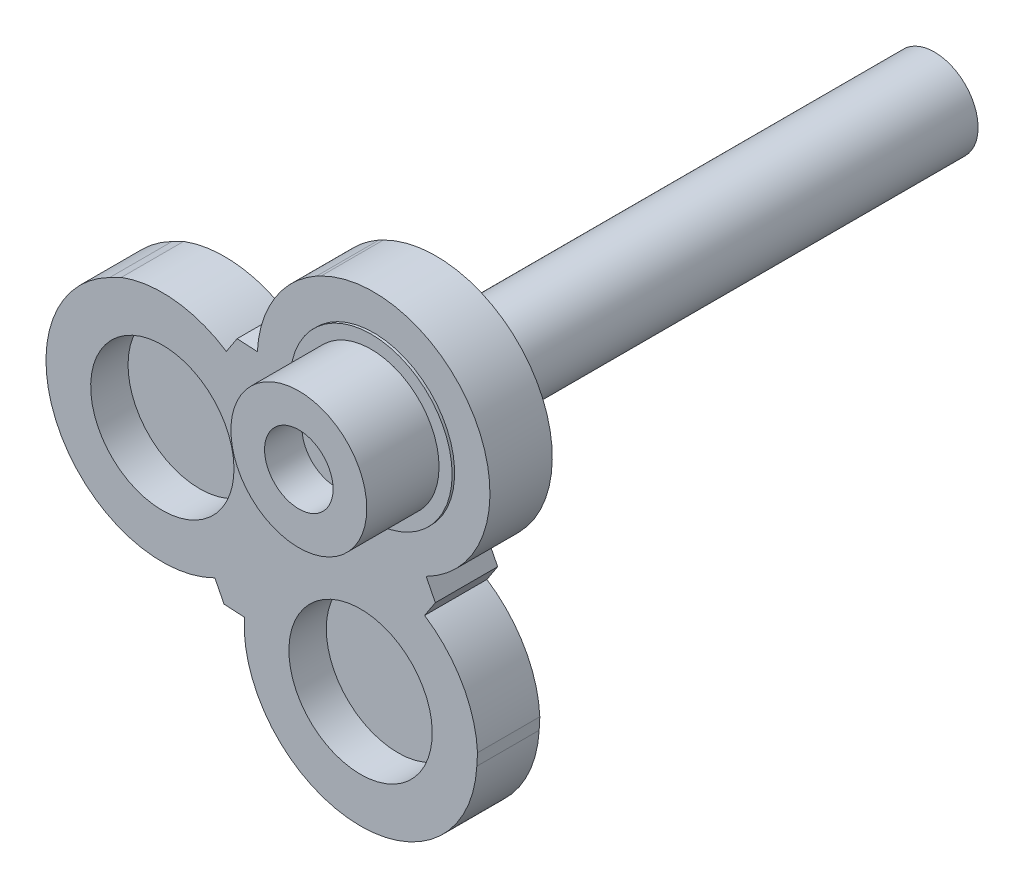
ISO-10303-21;
HEADER;
FILE_DESCRIPTION(('STEP AP214'),'2;1');
FILE_NAME('part.step','',(''),(''),'','','');
FILE_SCHEMA(('AUTOMOTIVE_DESIGN { 1 0 10303 214 1 1 1 1 }'));
ENDSEC;
DATA;
#1=APPLICATION_CONTEXT('core data for automotive mechanical design processes');
#2=APPLICATION_PROTOCOL_DEFINITION('international standard','automotive_design',2000,#1);
#3=PRODUCT_CONTEXT('',#1,'mechanical');
#4=PRODUCT('Part','Part','',(#3));
#5=PRODUCT_RELATED_PRODUCT_CATEGORY('part','',(#4));
#6=PRODUCT_DEFINITION_FORMATION('','',#4);
#7=PRODUCT_DEFINITION_CONTEXT('part definition',#1,'design');
#8=PRODUCT_DEFINITION('design','',#6,#7);
#9=PRODUCT_DEFINITION_SHAPE('','',#8);
#10=(LENGTH_UNIT() NAMED_UNIT(*) SI_UNIT(.MILLI.,.METRE.));
#11=(NAMED_UNIT(*) PLANE_ANGLE_UNIT() SI_UNIT($,.RADIAN.));
#12=(NAMED_UNIT(*) SI_UNIT($,.STERADIAN.) SOLID_ANGLE_UNIT());
#13=UNCERTAINTY_MEASURE_WITH_UNIT(LENGTH_MEASURE(1.E-05),#10,'distance_accuracy_value','');
#14=(GEOMETRIC_REPRESENTATION_CONTEXT(3) GLOBAL_UNCERTAINTY_ASSIGNED_CONTEXT((#13)) GLOBAL_UNIT_ASSIGNED_CONTEXT((#10,
#11,#12)) REPRESENTATION_CONTEXT('',''));
#15=CARTESIAN_POINT('',(0.,0.,0.));
#16=DIRECTION('',(0.,0.,1.));
#17=DIRECTION('',(1.,0.,0.));
#18=AXIS2_PLACEMENT_3D('',#15,#16,#17);
#19=CARTESIAN_POINT('',(0.,0.,11.));
#20=DIRECTION('',(0.,0.,-1.));
#21=DIRECTION('',(-1.,0.,0.));
#22=AXIS2_PLACEMENT_3D('',#19,#20,#21);
#23=CYLINDRICAL_SURFACE('',#22,6.5);
#24=CARTESIAN_POINT('',(0.,0.,5.2));
#25=DIRECTION('',(0.,0.,1.));
#26=DIRECTION('',(1.,0.,0.));
#27=AXIS2_PLACEMENT_3D('',#24,#25,#26);
#28=CIRCLE('',#27,6.5);
#29=CARTESIAN_POINT('',(6.5,0.,5.2));
#30=VERTEX_POINT('',#29);
#31=EDGE_CURVE('E236',#30,#30,#28,.T.);
#32=ORIENTED_EDGE('',*,*,#31,.F.);
#33=EDGE_LOOP('',(#32));
#34=FACE_BOUND('',#33,.T.);
#35=CARTESIAN_POINT('',(0.,0.,5.));
#36=DIRECTION('',(0.,0.,-1.));
#37=DIRECTION('',(-1.,0.,0.));
#38=AXIS2_PLACEMENT_3D('',#35,#36,#37);
#39=CIRCLE('',#38,6.5);
#40=CARTESIAN_POINT('',(-6.5,0.,5.));
#41=VERTEX_POINT('',#40);
#42=EDGE_CURVE('E13',#41,#41,#39,.T.);
#43=ORIENTED_EDGE('',*,*,#42,.F.);
#44=EDGE_LOOP('',(#43));
#45=FACE_BOUND('',#44,.T.);
#46=ADVANCED_FACE('F55',(#34,#45),#23,.T.);
#47=CARTESIAN_POINT('',(0.,0.,11.));
#48=DIRECTION('',(0.,0.,1.));
#49=DIRECTION('',(1.,0.,0.));
#50=AXIS2_PLACEMENT_3D('',#47,#48,#49);
#51=PLANE('',#50);
#52=CARTESIAN_POINT('',(0.,0.,11.));
#53=DIRECTION('',(0.,0.,1.));
#54=DIRECTION('',(1.,0.,0.));
#55=AXIS2_PLACEMENT_3D('',#52,#53,#54);
#56=CIRCLE('',#55,2.75);
#57=CARTESIAN_POINT('',(2.75,0.,11.));
#58=VERTEX_POINT('',#57);
#59=EDGE_CURVE('E241',#58,#58,#56,.T.);
#60=ORIENTED_EDGE('',*,*,#59,.F.);
#61=EDGE_LOOP('',(#60));
#62=FACE_BOUND('',#61,.T.);
#63=CARTESIAN_POINT('',(0.,0.,11.));
#64=DIRECTION('',(0.,0.,1.));
#65=DIRECTION('',(1.,0.,0.));
#66=AXIS2_PLACEMENT_3D('',#63,#64,#65);
#67=CIRCLE('',#66,5.45);
#68=CARTESIAN_POINT('',(5.45,0.,11.));
#69=VERTEX_POINT('',#68);
#70=EDGE_CURVE('E229',#69,#69,#67,.T.);
#71=ORIENTED_EDGE('',*,*,#70,.T.);
#72=EDGE_LOOP('',(#71));
#73=FACE_BOUND('',#72,.T.);
#74=ADVANCED_FACE('F250',(#62,#73),#51,.T.);
#75=CARTESIAN_POINT('',(0.,0.,8.));
#76=DIRECTION('',(0.,0.,1.));
#77=DIRECTION('',(1.,0.,0.));
#78=AXIS2_PLACEMENT_3D('',#75,#76,#77);
#79=CYLINDRICAL_SURFACE('',#78,2.75);
#80=CARTESIAN_POINT('',(0.,0.,8.));
#81=DIRECTION('',(0.,0.,1.));
#82=DIRECTION('',(1.,0.,0.));
#83=AXIS2_PLACEMENT_3D('',#80,#81,#82);
#84=CIRCLE('',#83,2.75);
#85=CARTESIAN_POINT('',(2.75,0.,8.));
#86=VERTEX_POINT('',#85);
#87=EDGE_CURVE('E232',#86,#86,#84,.T.);
#88=ORIENTED_EDGE('',*,*,#87,.F.);
#89=EDGE_LOOP('',(#88));
#90=FACE_BOUND('',#89,.T.);
#91=ORIENTED_EDGE('',*,*,#59,.T.);
#92=EDGE_LOOP('',(#91));
#93=FACE_BOUND('',#92,.T.);
#94=ADVANCED_FACE('F467',(#90,#93),#79,.F.);
#95=CARTESIAN_POINT('',(0.,0.,8.));
#96=DIRECTION('',(0.,0.,1.));
#97=DIRECTION('',(1.,0.,0.));
#98=AXIS2_PLACEMENT_3D('',#95,#96,#97);
#99=PLANE('',#98);
#100=ORIENTED_EDGE('',*,*,#87,.T.);
#101=EDGE_LOOP('',(#100));
#102=FACE_BOUND('',#101,.T.);
#103=ADVANCED_FACE('F463',(#102),#99,.T.);
#104=CARTESIAN_POINT('',(0.,0.,5.2));
#105=DIRECTION('',(0.,0.,1.));
#106=DIRECTION('',(1.,0.,0.));
#107=AXIS2_PLACEMENT_3D('',#104,#105,#106);
#108=PLANE('',#107);
#109=CARTESIAN_POINT('',(0.,0.,5.2));
#110=DIRECTION('',(0.,0.,1.));
#111=DIRECTION('',(1.,0.,0.));
#112=AXIS2_PLACEMENT_3D('',#109,#110,#111);
#113=CIRCLE('',#112,5.45);
#114=CARTESIAN_POINT('',(5.45,0.,5.2));
#115=VERTEX_POINT('',#114);
#116=EDGE_CURVE('E233',#115,#115,#113,.T.);
#117=ORIENTED_EDGE('',*,*,#116,.F.);
#118=EDGE_LOOP('',(#117));
#119=FACE_BOUND('',#118,.T.);
#120=ORIENTED_EDGE('',*,*,#31,.T.);
#121=EDGE_LOOP('',(#120));
#122=FACE_BOUND('',#121,.T.);
#123=ADVANCED_FACE('F246',(#119,#122),#108,.T.);
#124=CARTESIAN_POINT('',(0.,0.,5.2));
#125=DIRECTION('',(0.,0.,1.));
#126=DIRECTION('',(1.,0.,0.));
#127=AXIS2_PLACEMENT_3D('',#124,#125,#126);
#128=CYLINDRICAL_SURFACE('',#127,5.45);
#129=ORIENTED_EDGE('',*,*,#116,.T.);
#130=EDGE_LOOP('',(#129));
#131=FACE_BOUND('',#130,.T.);
#132=ORIENTED_EDGE('',*,*,#70,.F.);
#133=EDGE_LOOP('',(#132));
#134=FACE_BOUND('',#133,.T.);
#135=ADVANCED_FACE('F447',(#131,#134),#128,.T.);
#136=CARTESIAN_POINT('',(4.21524270452771,-8.32944737926398,50.));
#137=DIRECTION('',(0.892252070647666,0.451537642312303,0.));
#138=DIRECTION('',(0.451537642312303,-0.892252070647666,0.));
#139=AXIS2_PLACEMENT_3D('',#136,#137,#138);
#140=PLANE('',#139);
#141=DIRECTION('',(0.451537642312303,-0.892252070647666,0.));
#142=VECTOR('',#141,1.);
#143=CARTESIAN_POINT('',(2.45880800460432,-4.85867916171607,5.));
#144=LINE('',#143,#142);
#145=CARTESIAN_POINT('',(4.21524270452771,-8.32944737926398,5.));
#146=VERTEX_POINT('',#145);
#147=CARTESIAN_POINT('',(4.95321220742696,-9.78769749029518,5.));
#148=VERTEX_POINT('',#147);
#149=EDGE_CURVE('E292',#146,#148,#144,.T.);
#150=ORIENTED_EDGE('',*,*,#149,.T.);
#151=DIRECTION('',(0.,0.,-1.));
#152=VECTOR('',#151,1.);
#153=CARTESIAN_POINT('',(4.95321220742696,-9.78769749029518,50.));
#154=LINE('',#153,#152);
#155=CARTESIAN_POINT('',(4.95321220742696,-9.78769749029518,0.));
#156=VERTEX_POINT('',#155);
#157=EDGE_CURVE('E294',#148,#156,#154,.T.);
#158=ORIENTED_EDGE('',*,*,#157,.T.);
#159=DIRECTION('',(0.451537642312303,-0.892252070647666,0.));
#160=VECTOR('',#159,1.);
#161=CARTESIAN_POINT('',(4.21524270452771,-8.32944737926398,0.));
#162=LINE('',#161,#160);
#163=CARTESIAN_POINT('',(4.21524270452771,-8.32944737926398,0.));
#164=VERTEX_POINT('',#163);
#165=EDGE_CURVE('E194',#164,#156,#162,.T.);
#166=ORIENTED_EDGE('',*,*,#165,.F.);
#167=DIRECTION('',(0.,0.,-1.));
#168=VECTOR('',#167,1.);
#169=CARTESIAN_POINT('',(4.21524270452771,-8.32944737926398,50.));
#170=LINE('',#169,#168);
#171=EDGE_CURVE('E295',#146,#164,#170,.T.);
#172=ORIENTED_EDGE('',*,*,#171,.F.);
#173=EDGE_LOOP('',(#150,#158,#166,#172));
#174=FACE_BOUND('',#173,.T.);
#175=ADVANCED_FACE('F352',(#174),#140,.T.);
#176=CARTESIAN_POINT('',(0.,0.,50.));
#177=DIRECTION('',(0.,0.,-1.));
#178=DIRECTION('',(-0.897869392809481,-0.440261914609853,0.));
#179=AXIS2_PLACEMENT_3D('',#176,#177,#178);
#180=CYLINDRICAL_SURFACE('',#179,9.33530742407561);
#181=CARTESIAN_POINT('',(0.,0.,5.));
#182=DIRECTION('',(0.,0.,-1.));
#183=DIRECTION('',(-0.897869392809481,-0.440261914609853,0.));
#184=AXIS2_PLACEMENT_3D('',#181,#182,#183);
#185=CIRCLE('',#184,9.33530742407561);
#186=CARTESIAN_POINT('',(-4.21524270452758,8.32944737926399,5.));
#187=VERTEX_POINT('',#186);
#188=EDGE_CURVE('E279',#187,#146,#185,.T.);
#189=ORIENTED_EDGE('',*,*,#188,.T.);
#190=ORIENTED_EDGE('',*,*,#171,.T.);
#191=CARTESIAN_POINT('',(0.,0.,0.));
#192=DIRECTION('',(0.,0.,-1.));
#193=DIRECTION('',(-0.897869392809481,-0.440261914609853,0.));
#194=AXIS2_PLACEMENT_3D('',#191,#192,#193);
#195=CIRCLE('',#194,9.33530742407561);
#196=CARTESIAN_POINT('',(-4.21524270452758,8.32944737926399,0.));
#197=VERTEX_POINT('',#196);
#198=EDGE_CURVE('E189',#197,#164,#195,.T.);
#199=ORIENTED_EDGE('',*,*,#198,.F.);
#200=DIRECTION('',(0.,0.,-1.));
#201=VECTOR('',#200,1.);
#202=CARTESIAN_POINT('',(-4.21524270452758,8.32944737926399,50.));
#203=LINE('',#202,#201);
#204=EDGE_CURVE('E307',#187,#197,#203,.T.);
#205=ORIENTED_EDGE('',*,*,#204,.F.);
#206=EDGE_LOOP('',(#189,#190,#199,#205));
#207=FACE_BOUND('',#206,.T.);
#208=ADVANCED_FACE('F347',(#207),#180,.T.);
#209=CARTESIAN_POINT('',(-4.21524270452758,8.32944737926399,50.));
#210=DIRECTION('',(-0.451537642312304,0.892252070647665,0.));
#211=DIRECTION('',(0.892252070647665,0.451537642312304,0.));
#212=AXIS2_PLACEMENT_3D('',#209,#210,#211);
#213=PLANE('',#212);
#214=DIRECTION('',(0.892252070647665,0.451537642312304,0.));
#215=VECTOR('',#214,1.);
#216=CARTESIAN_POINT('',(-12.6916373756804,4.03983977729711,5.));
#217=LINE('',#216,#215);
#218=CARTESIAN_POINT('',(-4.56983635010442,8.14999990699702,5.));
#219=VERTEX_POINT('',#218);
#220=EDGE_CURVE('E304',#219,#187,#217,.T.);
#221=ORIENTED_EDGE('',*,*,#220,.T.);
#222=ORIENTED_EDGE('',*,*,#204,.T.);
#223=DIRECTION('',(0.892252070647666,0.451537642312304,0.));
#224=VECTOR('',#223,1.);
#225=CARTESIAN_POINT('',(-4.21524270452758,8.32944737926399,0.));
#226=LINE('',#225,#224);
#227=CARTESIAN_POINT('',(-4.56983635010439,8.14999990699705,0.));
#228=VERTEX_POINT('',#227);
#229=EDGE_CURVE('E184',#228,#197,#226,.T.);
#230=ORIENTED_EDGE('',*,*,#229,.F.);
#231=DIRECTION('',(0.,0.,-1.));
#232=VECTOR('',#231,1.);
#233=CARTESIAN_POINT('',(-4.56983635010442,8.14999990699702,50.));
#234=LINE('',#233,#232);
#235=EDGE_CURVE('E300',#228,#219,#234,.F.);
#236=ORIENTED_EDGE('',*,*,#235,.T.);
#237=EDGE_LOOP('',(#221,#222,#230,#236));
#238=FACE_BOUND('',#237,.T.);
#239=ADVANCED_FACE('F384',(#238),#213,.T.);
#240=CARTESIAN_POINT('',(0.,0.,50.));
#241=DIRECTION('',(0.,0.,-1.));
#242=DIRECTION('',(-0.897869392809481,-0.440261914609853,0.));
#243=AXIS2_PLACEMENT_3D('',#240,#241,#242);
#244=CYLINDRICAL_SURFACE('',#243,9.34376277260867);
#245=CARTESIAN_POINT('',(0.,0.,5.));
#246=DIRECTION('',(0.,0.,-1.));
#247=DIRECTION('',(-0.897869392809481,-0.440261914609853,0.));
#248=AXIS2_PLACEMENT_3D('',#245,#246,#247);
#249=CIRCLE('',#248,9.34376277260867);
#250=CARTESIAN_POINT('',(-9.32957689365364,0.514682170072479,5.));
#251=VERTEX_POINT('',#250);
#252=EDGE_CURVE('E310',#251,#219,#249,.T.);
#253=ORIENTED_EDGE('',*,*,#252,.T.);
#254=ORIENTED_EDGE('',*,*,#235,.F.);
#255=CARTESIAN_POINT('',(0.,0.,0.));
#256=DIRECTION('',(0.,0.,-1.));
#257=DIRECTION('',(-0.897869392809481,-0.440261914609853,0.));
#258=AXIS2_PLACEMENT_3D('',#255,#256,#257);
#259=CIRCLE('',#258,9.34376277260867);
#260=CARTESIAN_POINT('',(-9.32957689365364,0.514682170072479,0.));
#261=VERTEX_POINT('',#260);
#262=EDGE_CURVE('E190',#261,#228,#259,.T.);
#263=ORIENTED_EDGE('',*,*,#262,.F.);
#264=DIRECTION('',(0.,0.,-1.));
#265=VECTOR('',#264,1.);
#266=CARTESIAN_POINT('',(-9.32957689365364,0.514682170072479,50.));
#267=LINE('',#266,#265);
#268=EDGE_CURVE('E316',#251,#261,#267,.T.);
#269=ORIENTED_EDGE('',*,*,#268,.F.);
#270=EDGE_LOOP('',(#253,#254,#263,#269));
#271=FACE_BOUND('',#270,.T.);
#272=ADVANCED_FACE('F382',(#271),#244,.T.);
#273=CARTESIAN_POINT('',(-19.3143947028166,1.06551183323693,50.));
#274=DIRECTION('',(0.0550829663164454,0.998481780916298,0.));
#275=DIRECTION('',(0.998481780916298,-0.0550829663164454,0.));
#276=AXIS2_PLACEMENT_3D('',#273,#274,#275);
#277=PLANE('',#276);
#278=DIRECTION('',(0.998481780916298,-0.0550829663164454,0.));
#279=VECTOR('',#278,1.);
#280=CARTESIAN_POINT('',(-5.49617878855648,0.303206164464428,5.));
#281=LINE('',#280,#279);
#282=CARTESIAN_POINT('',(-10.9530007748662,0.604241143180714,5.));
#283=VERTEX_POINT('',#282);
#284=EDGE_CURVE('E317',#283,#251,#281,.T.);
#285=ORIENTED_EDGE('',*,*,#284,.T.);
#286=ORIENTED_EDGE('',*,*,#268,.T.);
#287=DIRECTION('',(0.998481780916298,-0.0550829663164454,0.));
#288=VECTOR('',#287,1.);
#289=CARTESIAN_POINT('',(-19.3143947028166,1.06551183323693,0.));
#290=LINE('',#289,#288);
#291=CARTESIAN_POINT('',(-10.9530007748662,0.604241143180714,0.));
#292=VERTEX_POINT('',#291);
#293=EDGE_CURVE('E195',#292,#261,#290,.T.);
#294=ORIENTED_EDGE('',*,*,#293,.F.);
#295=DIRECTION('',(0.,0.,-1.));
#296=VECTOR('',#295,1.);
#297=CARTESIAN_POINT('',(-10.9530007748662,0.604241143180712,50.));
#298=LINE('',#297,#296);
#299=EDGE_CURVE('E312',#283,#292,#298,.T.);
#300=ORIENTED_EDGE('',*,*,#299,.F.);
#301=EDGE_LOOP('',(#285,#286,#294,#300));
#302=FACE_BOUND('',#301,.T.);
#303=ADVANCED_FACE('F373',(#302),#277,.T.);
#304=CARTESIAN_POINT('',(-11.8150434775229,-0.715227274783058,50.));
#305=DIRECTION('',(-0.837169104331218,0.546944138603995,0.));
#306=DIRECTION('',(0.546944138603995,0.837169104331218,0.));
#307=AXIS2_PLACEMENT_3D('',#304,#305,#306);
#308=PLANE('',#307);
#309=DIRECTION('',(0.546944138603995,0.837169104331218,0.));
#310=VECTOR('',#309,1.);
#311=CARTESIAN_POINT('',(-13.9421157070171,-3.97098783153483,5.));
#312=LINE('',#311,#310);
#313=CARTESIAN_POINT('',(-11.8150434775229,-0.715227274783058,5.));
#314=VERTEX_POINT('',#313);
#315=EDGE_CURVE('E313',#314,#283,#312,.T.);
#316=ORIENTED_EDGE('',*,*,#315,.T.);
#317=ORIENTED_EDGE('',*,*,#299,.T.);
#318=DIRECTION('',(0.546944138603995,0.837169104331219,0.));
#319=VECTOR('',#318,1.);
#320=CARTESIAN_POINT('',(-11.8150434775229,-0.715227274783058,0.));
#321=LINE('',#320,#319);
#322=CARTESIAN_POINT('',(-11.8150434775229,-0.715227274783058,0.));
#323=VERTEX_POINT('',#322);
#324=EDGE_CURVE('E176',#323,#292,#321,.T.);
#325=ORIENTED_EDGE('',*,*,#324,.F.);
#326=DIRECTION('',(0.,0.,-1.));
#327=VECTOR('',#326,1.);
#328=CARTESIAN_POINT('',(-11.8150434775229,-0.715227274783058,50.));
#329=LINE('',#328,#327);
#330=EDGE_CURVE('E172',#314,#323,#329,.T.);
#331=ORIENTED_EDGE('',*,*,#330,.F.);
#332=EDGE_LOOP('',(#316,#317,#325,#331));
#333=FACE_BOUND('',#332,.T.);
#334=ADVANCED_FACE('F380',(#333),#308,.T.);
#335=CARTESIAN_POINT('',(-16.9527893423056,-8.57921520393376,50.));
#336=DIRECTION('',(0.,0.,-1.));
#337=DIRECTION('',(-0.897869392809481,-0.440261914609853,0.));
#338=AXIS2_PLACEMENT_3D('',#335,#336,#337);
#339=CYLINDRICAL_SURFACE('',#338,9.3935477174984);
#340=CARTESIAN_POINT('',(-16.9527893423056,-8.57921520393376,5.));
#341=DIRECTION('',(0.,0.,-1.));
#342=DIRECTION('',(-0.897869392809481,-0.440261914609853,0.));
#343=AXIS2_PLACEMENT_3D('',#340,#341,#342);
#344=CIRCLE('',#343,9.3935477174984);
#345=CARTESIAN_POINT('',(-20.2361628484656,0.221818663741432,5.));
#346=VERTEX_POINT('',#345);
#347=EDGE_CURVE('E308',#346,#314,#344,.T.);
#348=ORIENTED_EDGE('',*,*,#347,.T.);
#349=ORIENTED_EDGE('',*,*,#330,.T.);
#350=CARTESIAN_POINT('',(-16.9527893423056,-8.57921520393376,0.));
#351=DIRECTION('',(0.,0.,-1.));
#352=DIRECTION('',(-0.897869392809481,-0.440261914609853,0.));
#353=AXIS2_PLACEMENT_3D('',#350,#351,#352);
#354=CIRCLE('',#353,9.3935477174984);
#355=CARTESIAN_POINT('',(-20.2361628484656,0.22181866374143,0.));
#356=VERTEX_POINT('',#355);
#357=EDGE_CURVE('E169',#356,#323,#354,.T.);
#358=ORIENTED_EDGE('',*,*,#357,.F.);
#359=DIRECTION('',(0.,0.,-1.));
#360=VECTOR('',#359,1.);
#361=CARTESIAN_POINT('',(-20.2361628484656,0.221818663741432,50.));
#362=LINE('',#361,#360);
#363=EDGE_CURVE('E155',#346,#356,#362,.T.);
#364=ORIENTED_EDGE('',*,*,#363,.F.);
#365=EDGE_LOOP('',(#348,#349,#358,#364));
#366=FACE_BOUND('',#365,.T.);
#367=ADVANCED_FACE('F170',(#366),#339,.T.);
#368=DIRECTION('',(0.892252070647665,0.451537642312304,0.));
#369=VECTOR('',#368,1.);
#370=CARTESIAN_POINT('',(-12.6916373756804,4.03983977729711,5.));
#371=LINE('',#370,#369);
#372=CARTESIAN_POINT('',(-21.1680320468332,-0.249767824669771,5.));
#373=VERTEX_POINT('',#372);
#374=EDGE_CURVE('E163',#373,#346,#371,.T.);
#375=ORIENTED_EDGE('',*,*,#374,.T.);
#376=ORIENTED_EDGE('',*,*,#363,.T.);
#377=CARTESIAN_POINT('',(-21.1680320468332,-0.249767824669771,0.));
#378=VERTEX_POINT('',#377);
#379=EDGE_CURVE('E160',#378,#356,#226,.T.);
#380=ORIENTED_EDGE('',*,*,#379,.F.);
#381=DIRECTION('',(0.,0.,-1.));
#382=VECTOR('',#381,1.);
#383=CARTESIAN_POINT('',(-21.1680320468332,-0.249767824669771,50.));
#384=LINE('',#383,#382);
#385=EDGE_CURVE('E299',#373,#378,#384,.T.);
#386=ORIENTED_EDGE('',*,*,#385,.F.);
#387=EDGE_LOOP('',(#375,#376,#380,#386));
#388=FACE_BOUND('',#387,.T.);
#389=ADVANCED_FACE('F157',(#388),#213,.T.);
#390=CARTESIAN_POINT('',(-16.9527893423056,-8.57921520393376,50.));
#391=DIRECTION('',(0.,0.,-1.));
#392=DIRECTION('',(-0.897869392809481,-0.440261914609853,0.));
#393=AXIS2_PLACEMENT_3D('',#390,#391,#392);
#394=CYLINDRICAL_SURFACE('',#393,9.33530742407561);
#395=CARTESIAN_POINT('',(-16.9527893423056,-8.57921520393376,5.));
#396=DIRECTION('',(0.,0.,-1.));
#397=DIRECTION('',(-0.897869392809481,-0.440261914609853,0.));
#398=AXIS2_PLACEMENT_3D('',#395,#396,#397);
#399=CIRCLE('',#398,9.33530742407561);
#400=CARTESIAN_POINT('',(-12.7375466377779,-16.9086625831977,5.));
#401=VERTEX_POINT('',#400);
#402=EDGE_CURVE('E296',#401,#373,#399,.T.);
#403=ORIENTED_EDGE('',*,*,#402,.T.);
#404=ORIENTED_EDGE('',*,*,#385,.T.);
#405=CARTESIAN_POINT('',(-16.9527893423056,-8.57921520393376,0.));
#406=DIRECTION('',(0.,0.,-1.));
#407=DIRECTION('',(-0.897869392809481,-0.440261914609853,0.));
#408=AXIS2_PLACEMENT_3D('',#405,#406,#407);
#409=CIRCLE('',#408,9.33530742407561);
#410=CARTESIAN_POINT('',(-12.7375466377779,-16.9086625831977,0.));
#411=VERTEX_POINT('',#410);
#412=EDGE_CURVE('E182',#411,#378,#409,.T.);
#413=ORIENTED_EDGE('',*,*,#412,.F.);
#414=DIRECTION('',(0.,0.,-1.));
#415=VECTOR('',#414,1.);
#416=CARTESIAN_POINT('',(-12.7375466377779,-16.9086625831977,50.));
#417=LINE('',#416,#415);
#418=EDGE_CURVE('E71',#401,#411,#417,.T.);
#419=ORIENTED_EDGE('',*,*,#418,.F.);
#420=EDGE_LOOP('',(#403,#404,#413,#419));
#421=FACE_BOUND('',#420,.T.);
#422=ADVANCED_FACE('F339',(#421),#394,.T.);
#423=CARTESIAN_POINT('',(-8.22217021465489,-25.8311832896744,50.));
#424=DIRECTION('',(-0.892252070647666,-0.451537642312303,0.));
#425=DIRECTION('',(-0.451537642312303,0.892252070647666,0.));
#426=AXIS2_PLACEMENT_3D('',#423,#424,#425);
#427=PLANE('',#426);
#428=DIRECTION('',(-0.451537642312303,0.892252070647666,0.));
#429=VECTOR('',#428,1.);
#430=CARTESIAN_POINT('',(-14.4939813377013,-13.4378943656498,5.));
#431=LINE('',#430,#429);
#432=CARTESIAN_POINT('',(-11.9995771348787,-18.3669126942289,5.));
#433=VERTEX_POINT('',#432);
#434=EDGE_CURVE('E166',#433,#401,#431,.T.);
#435=ORIENTED_EDGE('',*,*,#434,.T.);
#436=ORIENTED_EDGE('',*,*,#418,.T.);
#437=DIRECTION('',(-0.451537642312303,0.892252070647666,0.));
#438=VECTOR('',#437,1.);
#439=CARTESIAN_POINT('',(-8.22217021465489,-25.8311832896744,0.));
#440=LINE('',#439,#438);
#441=CARTESIAN_POINT('',(-11.9995771348787,-18.3669126942289,0.));
#442=VERTEX_POINT('',#441);
#443=EDGE_CURVE('E185',#442,#411,#440,.T.);
#444=ORIENTED_EDGE('',*,*,#443,.F.);
#445=DIRECTION('',(0.,0.,1.));
#446=VECTOR('',#445,1.);
#447=CARTESIAN_POINT('',(-11.9995771348787,-18.3669126942289,50.));
#448=LINE('',#447,#446);
#449=EDGE_CURVE('E216',#442,#433,#448,.T.);
#450=ORIENTED_EDGE('',*,*,#449,.T.);
#451=EDGE_LOOP('',(#435,#436,#444,#450));
#452=FACE_BOUND('',#451,.T.);
#453=ADVANCED_FACE('F332',(#452),#427,.T.);
#454=CARTESIAN_POINT('',(-10.3761532536661,-18.4564716673372,50.));
#455=DIRECTION('',(-0.0550829663164458,-0.998481780916298,0.));
#456=DIRECTION('',(-0.998481780916298,0.0550829663164458,0.));
#457=AXIS2_PLACEMENT_3D('',#454,#455,#456);
#458=PLANE('',#457);
#459=DIRECTION('',(-0.998481780916298,0.0550829663164458,0.));
#460=VECTOR('',#459,1.);
#461=CARTESIAN_POINT('',(-6.54275514856894,-18.6679476729452,5.));
#462=LINE('',#461,#460);
#463=CARTESIAN_POINT('',(-10.3761532536661,-18.4564716673372,5.));
#464=VERTEX_POINT('',#463);
#465=EDGE_CURVE('E287',#464,#433,#462,.T.);
#466=ORIENTED_EDGE('',*,*,#465,.T.);
#467=ORIENTED_EDGE('',*,*,#449,.F.);
#468=DIRECTION('',(-0.998481780916298,0.0550829663164458,0.));
#469=VECTOR('',#468,1.);
#470=CARTESIAN_POINT('',(-10.3761532536661,-18.4564716673372,0.));
#471=LINE('',#470,#469);
#472=CARTESIAN_POINT('',(-10.3761532536661,-18.4564716673372,0.));
#473=VERTEX_POINT('',#472);
#474=EDGE_CURVE('E209',#473,#442,#471,.T.);
#475=ORIENTED_EDGE('',*,*,#474,.F.);
#476=DIRECTION('',(0.,0.,-1.));
#477=VECTOR('',#476,1.);
#478=CARTESIAN_POINT('',(-10.3761532536661,-18.4564716673372,50.));
#479=LINE('',#478,#477);
#480=EDGE_CURVE('E284',#464,#473,#479,.T.);
#481=ORIENTED_EDGE('',*,*,#480,.F.);
#482=EDGE_LOOP('',(#466,#467,#475,#481));
#483=FACE_BOUND('',#482,.T.);
#484=ADVANCED_FACE('F413',(#483),#458,.T.);
#485=CARTESIAN_POINT('',(-1.04657636001241,-18.9711538374096,50.));
#486=DIRECTION('',(0.,0.,-1.));
#487=DIRECTION('',(-0.897869392809481,-0.440261914609853,0.));
#488=AXIS2_PLACEMENT_3D('',#485,#486,#487);
#489=CYLINDRICAL_SURFACE('',#488,9.34376277260867);
#490=CARTESIAN_POINT('',(-1.04657636001241,-18.9711538374096,5.));
#491=DIRECTION('',(0.,0.,-1.));
#492=DIRECTION('',(-0.897869392809481,-0.440261914609853,0.));
#493=AXIS2_PLACEMENT_3D('',#490,#491,#492);
#494=CIRCLE('',#493,9.34376277260867);
#495=CARTESIAN_POINT('',(8.28300053364129,-19.4858360074821,5.));
#496=VERTEX_POINT('',#495);
#497=EDGE_CURVE('E285',#496,#464,#494,.T.);
#498=ORIENTED_EDGE('',*,*,#497,.T.);
#499=ORIENTED_EDGE('',*,*,#480,.T.);
#500=CARTESIAN_POINT('',(-1.04657636001241,-18.9711538374096,0.));
#501=DIRECTION('',(0.,0.,-1.));
#502=DIRECTION('',(-0.897869392809481,-0.440261914609853,0.));
#503=AXIS2_PLACEMENT_3D('',#500,#501,#502);
#504=CIRCLE('',#503,9.34376277260867);
#505=CARTESIAN_POINT('',(8.28300053364129,-19.4858360074821,0.));
#506=VERTEX_POINT('',#505);
#507=EDGE_CURVE('E205',#506,#473,#504,.T.);
#508=ORIENTED_EDGE('',*,*,#507,.F.);
#509=DIRECTION('',(0.,0.,-1.));
#510=VECTOR('',#509,1.);
#511=CARTESIAN_POINT('',(8.28300053364129,-19.4858360074821,50.));
#512=LINE('',#511,#510);
#513=EDGE_CURVE('E116',#496,#506,#512,.T.);
#514=ORIENTED_EDGE('',*,*,#513,.F.);
#515=EDGE_LOOP('',(#498,#499,#508,#514));
#516=FACE_BOUND('',#515,.T.);
#517=ADVANCED_FACE('F416',(#516),#489,.T.);
#518=CARTESIAN_POINT('',(8.28300053364129,-19.4858360074821,50.));
#519=DIRECTION('',(0.998481780916298,-0.0550829663164463,0.));
#520=DIRECTION('',(-0.0550829663164463,-0.998481780916298,0.));
#521=AXIS2_PLACEMENT_3D('',#518,#519,#520);
#522=PLANE('',#521);
#523=DIRECTION('',(-0.0550829663164463,-0.998481780916298,0.));
#524=VECTOR('',#523,1.);
#525=CARTESIAN_POINT('',(8.80816901566174,-9.96617509821984,5.));
#526=LINE('',#525,#524);
#527=CARTESIAN_POINT('',(8.33620155399629,-18.5214680167415,5.));
#528=VERTEX_POINT('',#527);
#529=EDGE_CURVE('E123',#528,#496,#526,.T.);
#530=ORIENTED_EDGE('',*,*,#529,.T.);
#531=ORIENTED_EDGE('',*,*,#513,.T.);
#532=DIRECTION('',(-0.0550829663164464,-0.998481780916298,0.));
#533=VECTOR('',#532,1.);
#534=CARTESIAN_POINT('',(8.28300053364129,-19.4858360074821,0.));
#535=LINE('',#534,#533);
#536=CARTESIAN_POINT('',(8.3362015539963,-18.5214680167416,0.));
#537=VERTEX_POINT('',#536);
#538=EDGE_CURVE('E202',#537,#506,#535,.T.);
#539=ORIENTED_EDGE('',*,*,#538,.F.);
#540=DIRECTION('',(0.,0.,-1.));
#541=VECTOR('',#540,1.);
#542=CARTESIAN_POINT('',(8.33620155399629,-18.5214680167415,50.));
#543=LINE('',#542,#541);
#544=EDGE_CURVE('E276',#528,#537,#543,.T.);
#545=ORIENTED_EDGE('',*,*,#544,.F.);
#546=EDGE_LOOP('',(#530,#531,#539,#545));
#547=FACE_BOUND('',#546,.T.);
#548=ADVANCED_FACE('F409',(#547),#522,.T.);
#549=CARTESIAN_POINT('',(-1.04657636001241,-18.9711538374096,50.));
#550=DIRECTION('',(0.,0.,-1.));
#551=DIRECTION('',(-0.897869392809481,-0.440261914609853,0.));
#552=AXIS2_PLACEMENT_3D('',#549,#550,#551);
#553=CYLINDRICAL_SURFACE('',#552,9.3935477174984);
#554=CARTESIAN_POINT('',(-1.04657636001241,-18.9711538374096,5.));
#555=DIRECTION('',(0.,0.,-1.));
#556=DIRECTION('',(-0.897869392809481,-0.440261914609853,0.));
#557=AXIS2_PLACEMENT_3D('',#554,#555,#556);
#558=CIRCLE('',#557,9.3935477174984);
#559=CARTESIAN_POINT('',(4.09116950477026,-11.1071659082589,5.));
#560=VERTEX_POINT('',#559);
#561=EDGE_CURVE('E270',#560,#528,#558,.T.);
#562=ORIENTED_EDGE('',*,*,#561,.T.);
#563=ORIENTED_EDGE('',*,*,#544,.T.);
#564=CARTESIAN_POINT('',(-1.04657636001241,-18.9711538374096,0.));
#565=DIRECTION('',(0.,0.,-1.));
#566=DIRECTION('',(-0.897869392809481,-0.440261914609853,0.));
#567=AXIS2_PLACEMENT_3D('',#564,#565,#566);
#568=CIRCLE('',#567,9.3935477174984);
#569=CARTESIAN_POINT('',(4.09116950477026,-11.1071659082589,0.));
#570=VERTEX_POINT('',#569);
#571=EDGE_CURVE('E206',#570,#537,#568,.T.);
#572=ORIENTED_EDGE('',*,*,#571,.F.);
#573=DIRECTION('',(0.,0.,-1.));
#574=VECTOR('',#573,1.);
#575=CARTESIAN_POINT('',(4.09116950477026,-11.1071659082589,50.));
#576=LINE('',#575,#574);
#577=EDGE_CURVE('E277',#560,#570,#576,.T.);
#578=ORIENTED_EDGE('',*,*,#577,.F.);
#579=EDGE_LOOP('',(#562,#563,#572,#578));
#580=FACE_BOUND('',#579,.T.);
#581=ADVANCED_FACE('F406',(#580),#553,.T.);
#582=CARTESIAN_POINT('',(9.56061089081021,-2.73547486494676,50.));
#583=DIRECTION('',(0.837169104331219,-0.546944138603994,0.));
#584=DIRECTION('',(-0.546944138603994,-0.837169104331219,0.));
#585=AXIS2_PLACEMENT_3D('',#582,#583,#584);
#586=PLANE('',#585);
#587=DIRECTION('',(-0.546944138603994,-0.837169104331219,0.));
#588=VECTOR('',#587,1.);
#589=CARTESIAN_POINT('',(1.96409727527608,-14.3629264650107,5.));
#590=LINE('',#589,#588);
#591=EDGE_CURVE('E272',#148,#560,#590,.T.);
#592=ORIENTED_EDGE('',*,*,#591,.T.);
#593=ORIENTED_EDGE('',*,*,#577,.T.);
#594=DIRECTION('',(-0.546944138603994,-0.837169104331219,0.));
#595=VECTOR('',#594,1.);
#596=CARTESIAN_POINT('',(9.56061089081021,-2.73547486494676,0.));
#597=LINE('',#596,#595);
#598=EDGE_CURVE('E223',#156,#570,#597,.T.);
#599=ORIENTED_EDGE('',*,*,#598,.F.);
#600=ORIENTED_EDGE('',*,*,#157,.F.);
#601=EDGE_LOOP('',(#592,#593,#599,#600));
#602=FACE_BOUND('',#601,.T.);
#603=ADVANCED_FACE('F257',(#602),#586,.T.);
#604=CARTESIAN_POINT('',(-6.0175866665485,-9.14828676368296,5.));
#605=DIRECTION('',(0.,0.,-1.));
#606=DIRECTION('',(-0.897869392809481,-0.440261914609853,0.));
#607=AXIS2_PLACEMENT_3D('',#604,#605,#606);
#608=PLANE('',#607);
#609=ORIENTED_EDGE('',*,*,#42,.T.);
#610=EDGE_LOOP('',(#609));
#611=FACE_BOUND('',#610,.T.);
#612=CARTESIAN_POINT('',(-16.9527893423056,-8.57921520393376,5.));
#613=DIRECTION('',(0.,0.,-1.));
#614=DIRECTION('',(-0.897869392809481,-0.440261914609853,0.));
#615=AXIS2_PLACEMENT_3D('',#612,#613,#614);
#616=CIRCLE('',#615,5.75);
#617=CARTESIAN_POINT('',(-22.1155383509601,-11.1107212129404,5.));
#618=VERTEX_POINT('',#617);
#619=EDGE_CURVE('E262',#618,#618,#616,.T.);
#620=ORIENTED_EDGE('',*,*,#619,.T.);
#621=EDGE_LOOP('',(#620));
#622=FACE_BOUND('',#621,.T.);
#623=CARTESIAN_POINT('',(-1.04657636001241,-18.9711538374096,5.));
#624=DIRECTION('',(0.,0.,-1.));
#625=DIRECTION('',(-0.897869392809481,-0.440261914609853,0.));
#626=AXIS2_PLACEMENT_3D('',#623,#624,#625);
#627=CIRCLE('',#626,5.75);
#628=CARTESIAN_POINT('',(-6.20932536866693,-21.5026598464163,5.));
#629=VERTEX_POINT('',#628);
#630=EDGE_CURVE('E266',#629,#629,#627,.T.);
#631=ORIENTED_EDGE('',*,*,#630,.T.);
#632=EDGE_LOOP('',(#631));
#633=FACE_BOUND('',#632,.T.);
#634=ORIENTED_EDGE('',*,*,#561,.F.);
#635=ORIENTED_EDGE('',*,*,#591,.F.);
#636=ORIENTED_EDGE('',*,*,#149,.F.);
#637=ORIENTED_EDGE('',*,*,#188,.F.);
#638=ORIENTED_EDGE('',*,*,#220,.F.);
#639=ORIENTED_EDGE('',*,*,#252,.F.);
#640=ORIENTED_EDGE('',*,*,#284,.F.);
#641=ORIENTED_EDGE('',*,*,#315,.F.);
#642=ORIENTED_EDGE('',*,*,#347,.F.);
#643=ORIENTED_EDGE('',*,*,#374,.F.);
#644=ORIENTED_EDGE('',*,*,#402,.F.);
#645=ORIENTED_EDGE('',*,*,#434,.F.);
#646=ORIENTED_EDGE('',*,*,#465,.F.);
#647=ORIENTED_EDGE('',*,*,#497,.F.);
#648=ORIENTED_EDGE('',*,*,#529,.F.);
#649=EDGE_LOOP('',(#634,#635,#636,#637,#638,#639,#640,#641,#642,#643,#644,#645,#646,#647,#648));
#650=FACE_BOUND('',#649,.T.);
#651=ADVANCED_FACE('F253',(#611,#622,#633,#650),#608,.F.);
#652=CARTESIAN_POINT('',(-1.04657636001241,-18.9711538374096,50.));
#653=DIRECTION('',(0.,0.,-1.));
#654=DIRECTION('',(-0.897869392809481,-0.440261914609853,0.));
#655=AXIS2_PLACEMENT_3D('',#652,#653,#654);
#656=CYLINDRICAL_SURFACE('',#655,5.75);
#657=ORIENTED_EDGE('',*,*,#630,.F.);
#658=EDGE_LOOP('',(#657));
#659=FACE_BOUND('',#658,.T.);
#660=CARTESIAN_POINT('',(-1.04657636001241,-18.9711538374096,2.));
#661=DIRECTION('',(0.,0.,-1.));
#662=DIRECTION('',(-1.,0.,0.));
#663=AXIS2_PLACEMENT_3D('',#660,#661,#662);
#664=CIRCLE('',#663,5.75);
#665=CARTESIAN_POINT('',(-6.79657636001241,-18.9711538374096,2.));
#666=VERTEX_POINT('',#665);
#667=EDGE_CURVE('E212',#666,#666,#664,.F.);
#668=ORIENTED_EDGE('',*,*,#667,.F.);
#669=EDGE_LOOP('',(#668));
#670=FACE_BOUND('',#669,.T.);
#671=ADVANCED_FACE('F256',(#659,#670),#656,.F.);
#672=CARTESIAN_POINT('',(-16.9527893423056,-8.57921520393376,50.));
#673=DIRECTION('',(0.,0.,-1.));
#674=DIRECTION('',(-0.897869392809481,-0.440261914609853,0.));
#675=AXIS2_PLACEMENT_3D('',#672,#673,#674);
#676=CYLINDRICAL_SURFACE('',#675,5.75);
#677=ORIENTED_EDGE('',*,*,#619,.F.);
#678=EDGE_LOOP('',(#677));
#679=FACE_BOUND('',#678,.T.);
#680=CARTESIAN_POINT('',(-16.9527893423056,-8.57921520393376,2.));
#681=DIRECTION('',(0.,0.,-1.));
#682=DIRECTION('',(-1.,0.,0.));
#683=AXIS2_PLACEMENT_3D('',#680,#681,#682);
#684=CIRCLE('',#683,5.75);
#685=CARTESIAN_POINT('',(-22.7027893423056,-8.57921520393376,2.));
#686=VERTEX_POINT('',#685);
#687=EDGE_CURVE('E215',#686,#686,#684,.F.);
#688=ORIENTED_EDGE('',*,*,#687,.F.);
#689=EDGE_LOOP('',(#688));
#690=FACE_BOUND('',#689,.T.);
#691=ADVANCED_FACE('F443',(#679,#690),#676,.F.);
#692=CARTESIAN_POINT('',(-1.04657636001241,-18.9711538374096,2.));
#693=DIRECTION('',(0.,0.,-1.));
#694=DIRECTION('',(-0.897869392809481,-0.440261914609853,0.));
#695=AXIS2_PLACEMENT_3D('',#692,#693,#694);
#696=PLANE('',#695);
#697=ORIENTED_EDGE('',*,*,#667,.T.);
#698=EDGE_LOOP('',(#697));
#699=FACE_BOUND('',#698,.T.);
#700=ADVANCED_FACE('F441',(#699),#696,.F.);
#701=CARTESIAN_POINT('',(-1.04657636001241,-18.9711538374096,-2.));
#702=DIRECTION('',(0.,0.,-1.));
#703=DIRECTION('',(-0.897869392809481,-0.440261914609853,0.));
#704=AXIS2_PLACEMENT_3D('',#701,#702,#703);
#705=PLANE('',#704);
#706=CARTESIAN_POINT('',(-1.04657636001241,-18.9711538374096,-2.));
#707=DIRECTION('',(0.,0.,-1.));
#708=DIRECTION('',(-0.897869392809481,-0.440261914609853,0.));
#709=AXIS2_PLACEMENT_3D('',#706,#707,#708);
#710=CIRCLE('',#709,5.75);
#711=CARTESIAN_POINT('',(-6.20932536866693,-21.5026598464163,-2.));
#712=VERTEX_POINT('',#711);
#713=EDGE_CURVE('E224',#712,#712,#710,.T.);
#714=ORIENTED_EDGE('',*,*,#713,.T.);
#715=EDGE_LOOP('',(#714));
#716=FACE_BOUND('',#715,.T.);
#717=ADVANCED_FACE('F438',(#716),#705,.T.);
#718=CARTESIAN_POINT('',(-1.04657636001241,-18.9711538374096,2.));
#719=DIRECTION('',(0.,0.,-1.));
#720=DIRECTION('',(-0.897869392809481,-0.440261914609853,0.));
#721=AXIS2_PLACEMENT_3D('',#718,#719,#720);
#722=CYLINDRICAL_SURFACE('',#721,5.75);
#723=CARTESIAN_POINT('',(-1.04657636001241,-18.9711538374096,0.));
#724=DIRECTION('',(0.,0.,-1.));
#725=DIRECTION('',(-0.897869392809481,-0.440261914609853,0.));
#726=AXIS2_PLACEMENT_3D('',#723,#724,#725);
#727=CIRCLE('',#726,5.75);
#728=CARTESIAN_POINT('',(-6.20932536866693,-21.5026598464163,0.));
#729=VERTEX_POINT('',#728);
#730=EDGE_CURVE('E290',#729,#729,#727,.T.);
#731=ORIENTED_EDGE('',*,*,#730,.T.);
#732=EDGE_LOOP('',(#731));
#733=FACE_BOUND('',#732,.T.);
#734=ORIENTED_EDGE('',*,*,#713,.F.);
#735=EDGE_LOOP('',(#734));
#736=FACE_BOUND('',#735,.T.);
#737=ADVANCED_FACE('F432',(#733,#736),#722,.T.);
#738=CARTESIAN_POINT('',(-16.9527893423056,-8.57921520393376,2.));
#739=DIRECTION('',(0.,0.,-1.));
#740=DIRECTION('',(-0.897869392809481,-0.440261914609853,0.));
#741=AXIS2_PLACEMENT_3D('',#738,#739,#740);
#742=PLANE('',#741);
#743=ORIENTED_EDGE('',*,*,#687,.T.);
#744=EDGE_LOOP('',(#743));
#745=FACE_BOUND('',#744,.T.);
#746=ADVANCED_FACE('F428',(#745),#742,.F.);
#747=CARTESIAN_POINT('',(-16.9527893423056,-8.57921520393376,-2.));
#748=DIRECTION('',(0.,0.,-1.));
#749=DIRECTION('',(-0.897869392809481,-0.440261914609853,0.));
#750=AXIS2_PLACEMENT_3D('',#747,#748,#749);
#751=PLANE('',#750);
#752=CARTESIAN_POINT('',(-16.9527893423056,-8.57921520393376,-2.));
#753=DIRECTION('',(0.,0.,-1.));
#754=DIRECTION('',(-0.897869392809481,-0.440261914609853,0.));
#755=AXIS2_PLACEMENT_3D('',#752,#753,#754);
#756=CIRCLE('',#755,5.75000000000001);
#757=CARTESIAN_POINT('',(-22.1155383509601,-11.1107212129404,-2.));
#758=VERTEX_POINT('',#757);
#759=EDGE_CURVE('E220',#758,#758,#756,.T.);
#760=ORIENTED_EDGE('',*,*,#759,.T.);
#761=EDGE_LOOP('',(#760));
#762=FACE_BOUND('',#761,.T.);
#763=ADVANCED_FACE('F424',(#762),#751,.T.);
#764=CARTESIAN_POINT('',(-16.9527893423056,-8.57921520393376,2.));
#765=DIRECTION('',(0.,0.,-1.));
#766=DIRECTION('',(-0.897869392809481,-0.440261914609853,0.));
#767=AXIS2_PLACEMENT_3D('',#764,#765,#766);
#768=CYLINDRICAL_SURFACE('',#767,5.75000000000001);
#769=CARTESIAN_POINT('',(-16.9527893423056,-8.57921520393376,0.));
#770=DIRECTION('',(0.,0.,-1.));
#771=DIRECTION('',(-0.897869392809481,-0.440261914609853,0.));
#772=AXIS2_PLACEMENT_3D('',#769,#770,#771);
#773=CIRCLE('',#772,5.75);
#774=CARTESIAN_POINT('',(-22.1155383509601,-11.1107212129404,0.));
#775=VERTEX_POINT('',#774);
#776=EDGE_CURVE('E320',#775,#775,#773,.T.);
#777=ORIENTED_EDGE('',*,*,#776,.T.);
#778=EDGE_LOOP('',(#777));
#779=FACE_BOUND('',#778,.T.);
#780=ORIENTED_EDGE('',*,*,#759,.F.);
#781=EDGE_LOOP('',(#780));
#782=FACE_BOUND('',#781,.T.);
#783=ADVANCED_FACE('F427',(#779,#782),#768,.T.);
#784=CARTESIAN_POINT('',(0.,0.,-40.));
#785=DIRECTION('',(0.,0.,-1.));
#786=DIRECTION('',(-1.,0.,0.));
#787=AXIS2_PLACEMENT_3D('',#784,#785,#786);
#788=PLANE('',#787);
#789=CARTESIAN_POINT('',(0.,0.,-40.));
#790=DIRECTION('',(0.,0.,-1.));
#791=DIRECTION('',(-1.,0.,0.));
#792=AXIS2_PLACEMENT_3D('',#789,#790,#791);
#793=CIRCLE('',#792,3.5);
#794=CARTESIAN_POINT('',(-3.5,0.,-40.));
#795=VERTEX_POINT('',#794);
#796=EDGE_CURVE('E219',#795,#795,#793,.T.);
#797=ORIENTED_EDGE('',*,*,#796,.T.);
#798=EDGE_LOOP('',(#797));
#799=FACE_BOUND('',#798,.T.);
#800=ADVANCED_FACE('F436',(#799),#788,.T.);
#801=CARTESIAN_POINT('',(0.,0.,-40.));
#802=DIRECTION('',(0.,0.,1.));
#803=DIRECTION('',(1.,0.,0.));
#804=AXIS2_PLACEMENT_3D('',#801,#802,#803);
#805=CYLINDRICAL_SURFACE('',#804,3.5);
#806=ORIENTED_EDGE('',*,*,#796,.F.);
#807=EDGE_LOOP('',(#806));
#808=FACE_BOUND('',#807,.T.);
#809=CARTESIAN_POINT('',(0.,0.,0.));
#810=DIRECTION('',(0.,0.,-1.));
#811=DIRECTION('',(-1.,0.,0.));
#812=AXIS2_PLACEMENT_3D('',#809,#810,#811);
#813=CIRCLE('',#812,3.5);
#814=CARTESIAN_POINT('',(-3.5,0.,0.));
#815=VERTEX_POINT('',#814);
#816=EDGE_CURVE('E63',#815,#815,#813,.T.);
#817=ORIENTED_EDGE('',*,*,#816,.T.);
#818=EDGE_LOOP('',(#817));
#819=FACE_BOUND('',#818,.T.);
#820=ADVANCED_FACE('F453',(#808,#819),#805,.T.);
#821=CARTESIAN_POINT('',(0.,0.,0.));
#822=DIRECTION('',(0.,0.,1.));
#823=DIRECTION('',(1.,0.,0.));
#824=AXIS2_PLACEMENT_3D('',#821,#822,#823);
#825=PLANE('',#824);
#826=ORIENTED_EDGE('',*,*,#776,.F.);
#827=EDGE_LOOP('',(#826));
#828=FACE_BOUND('',#827,.T.);
#829=ORIENTED_EDGE('',*,*,#730,.F.);
#830=EDGE_LOOP('',(#829));
#831=FACE_BOUND('',#830,.T.);
#832=ORIENTED_EDGE('',*,*,#598,.T.);
#833=ORIENTED_EDGE('',*,*,#571,.T.);
#834=ORIENTED_EDGE('',*,*,#538,.T.);
#835=ORIENTED_EDGE('',*,*,#507,.T.);
#836=ORIENTED_EDGE('',*,*,#474,.T.);
#837=ORIENTED_EDGE('',*,*,#443,.T.);
#838=ORIENTED_EDGE('',*,*,#412,.T.);
#839=ORIENTED_EDGE('',*,*,#379,.T.);
#840=ORIENTED_EDGE('',*,*,#357,.T.);
#841=ORIENTED_EDGE('',*,*,#324,.T.);
#842=ORIENTED_EDGE('',*,*,#293,.T.);
#843=ORIENTED_EDGE('',*,*,#262,.T.);
#844=ORIENTED_EDGE('',*,*,#229,.T.);
#845=ORIENTED_EDGE('',*,*,#198,.T.);
#846=ORIENTED_EDGE('',*,*,#165,.T.);
#847=EDGE_LOOP('',(#832,#833,#834,#835,#836,#837,#838,#839,#840,#841,#842,#843,#844,#845,#846));
#848=FACE_BOUND('',#847,.T.);
#849=ORIENTED_EDGE('',*,*,#816,.F.);
#850=EDGE_LOOP('',(#849));
#851=FACE_BOUND('',#850,.T.);
#852=ADVANCED_FACE('F179',(#828,#831,#848,#851),#825,.F.);
#853=CLOSED_SHELL('',(#46,#74,#94,#103,#123,#135,#175,#208,#239,#272,#303,#334,#367,#389,#422,
#453,#484,#517,#548,#581,#603,#651,#671,#691,#700,#717,#737,#746,#763,#783,#800,#820,#852));
#854=MANIFOLD_SOLID_BREP('B2',#853);
#855=ADVANCED_BREP_SHAPE_REPRESENTATION('',(#18,#854),#14);
#856=SHAPE_DEFINITION_REPRESENTATION(#9,#855);
ENDSEC;
END-ISO-10303-21;
